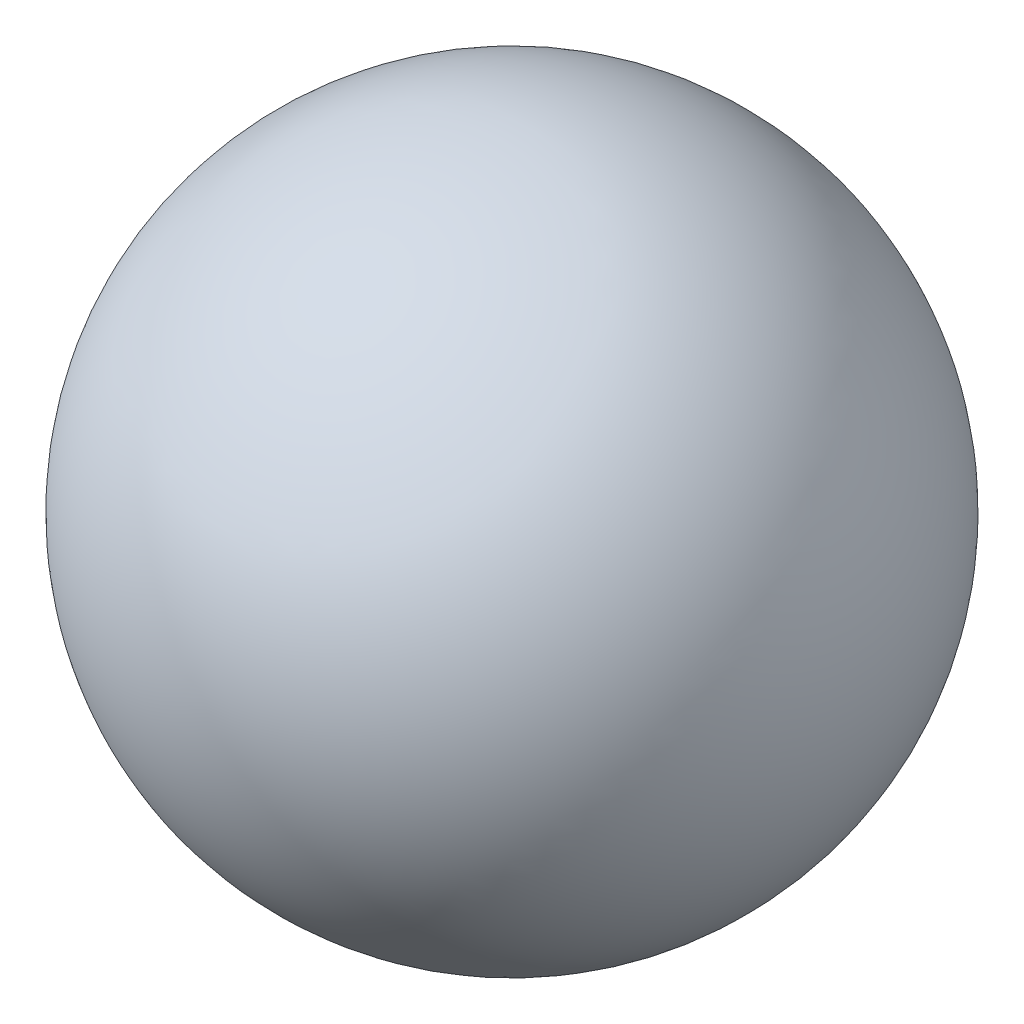
ISO-10303-21;
HEADER;
FILE_DESCRIPTION(('STEP AP214'),'2;1');
FILE_NAME('part.step','',(''),(''),'','','');
FILE_SCHEMA(('AUTOMOTIVE_DESIGN { 1 0 10303 214 1 1 1 1 }'));
ENDSEC;
DATA;
#1=APPLICATION_CONTEXT('core data for automotive mechanical design processes');
#2=APPLICATION_PROTOCOL_DEFINITION('international standard','automotive_design',2000,#1);
#3=PRODUCT_CONTEXT('',#1,'mechanical');
#4=PRODUCT('Part','Part','',(#3));
#5=PRODUCT_RELATED_PRODUCT_CATEGORY('part','',(#4));
#6=PRODUCT_DEFINITION_FORMATION('','',#4);
#7=PRODUCT_DEFINITION_CONTEXT('part definition',#1,'design');
#8=PRODUCT_DEFINITION('design','',#6,#7);
#9=PRODUCT_DEFINITION_SHAPE('','',#8);
#10=(LENGTH_UNIT() NAMED_UNIT(*) SI_UNIT(.MILLI.,.METRE.));
#11=(NAMED_UNIT(*) PLANE_ANGLE_UNIT() SI_UNIT($,.RADIAN.));
#12=(NAMED_UNIT(*) SI_UNIT($,.STERADIAN.) SOLID_ANGLE_UNIT());
#13=UNCERTAINTY_MEASURE_WITH_UNIT(LENGTH_MEASURE(1.E-05),#10,'distance_accuracy_value','');
#14=(GEOMETRIC_REPRESENTATION_CONTEXT(3) GLOBAL_UNCERTAINTY_ASSIGNED_CONTEXT((#13)) GLOBAL_UNIT_ASSIGNED_CONTEXT((#10,
#11,#12)) REPRESENTATION_CONTEXT('',''));
#15=CARTESIAN_POINT('',(0.,0.,0.));
#16=DIRECTION('',(0.,0.,1.));
#17=DIRECTION('',(1.,0.,0.));
#18=AXIS2_PLACEMENT_3D('',#15,#16,#17);
#19=CARTESIAN_POINT('',(0.,0.,0.));
#20=DIRECTION('',(0.,0.,-1.));
#21=DIRECTION('',(1.,0.,0.));
#22=AXIS2_PLACEMENT_3D('',#19,#20,#21);
#23=SPHERICAL_SURFACE('',#22,32.110968784178);
#24=CARTESIAN_POINT('',(0.,0.,-32.110968784178));
#25=VERTEX_POINT('',#24);
#26=VERTEX_LOOP('',#25);
#27=FACE_BOUND('',#26,.T.);
#28=ADVANCED_FACE('F34',(#27),#23,.T.);
#29=CLOSED_SHELL('',(#28));
#30=CARTESIAN_POINT('',(0.,0.,0.));
#31=DIRECTION('',(0.,0.,-1.));
#32=DIRECTION('',(1.,0.,0.));
#33=AXIS2_PLACEMENT_3D('',#30,#31,#32);
#34=SPHERICAL_SURFACE('',#33,29.570968784178);
#35=CARTESIAN_POINT('',(0.,0.,-29.570968784178));
#36=VERTEX_POINT('',#35);
#37=VERTEX_LOOP('',#36);
#38=FACE_BOUND('',#37,.T.);
#39=ADVANCED_FACE('F47',(#38),#34,.F.);
#40=CLOSED_SHELL('',(#39));
#41=ORIENTED_CLOSED_SHELL('',*,#40,.T.);
#42=BREP_WITH_VOIDS('B2',#29,(#41));
#43=ADVANCED_BREP_SHAPE_REPRESENTATION('',(#18,#42),#14);
#44=SHAPE_DEFINITION_REPRESENTATION(#9,#43);
ENDSEC;
END-ISO-10303-21;
